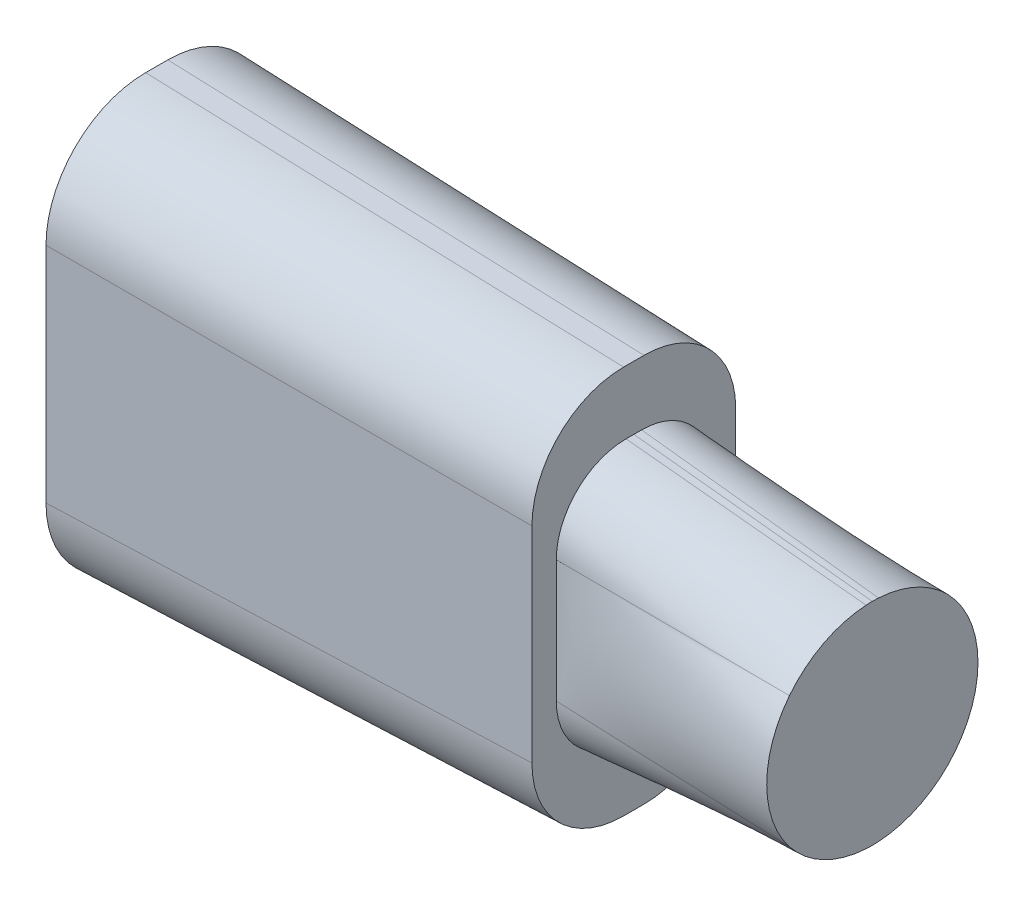
ISO-10303-21;
HEADER;
FILE_DESCRIPTION(('STEP AP214'),'2;1');
FILE_NAME('part.step','',(''),(''),'','','');
FILE_SCHEMA(('AUTOMOTIVE_DESIGN { 1 0 10303 214 1 1 1 1 }'));
ENDSEC;
DATA;
#1=APPLICATION_CONTEXT('core data for automotive mechanical design processes');
#2=APPLICATION_PROTOCOL_DEFINITION('international standard','automotive_design',2000,#1);
#3=PRODUCT_CONTEXT('',#1,'mechanical');
#4=PRODUCT('Part','Part','',(#3));
#5=PRODUCT_RELATED_PRODUCT_CATEGORY('part','',(#4));
#6=PRODUCT_DEFINITION_FORMATION('','',#4);
#7=PRODUCT_DEFINITION_CONTEXT('part definition',#1,'design');
#8=PRODUCT_DEFINITION('design','',#6,#7);
#9=PRODUCT_DEFINITION_SHAPE('','',#8);
#10=(LENGTH_UNIT() NAMED_UNIT(*) SI_UNIT(.MILLI.,.METRE.));
#11=(NAMED_UNIT(*) PLANE_ANGLE_UNIT() SI_UNIT($,.RADIAN.));
#12=(NAMED_UNIT(*) SI_UNIT($,.STERADIAN.) SOLID_ANGLE_UNIT());
#13=UNCERTAINTY_MEASURE_WITH_UNIT(LENGTH_MEASURE(1.E-05),#10,'distance_accuracy_value','');
#14=(GEOMETRIC_REPRESENTATION_CONTEXT(3) GLOBAL_UNCERTAINTY_ASSIGNED_CONTEXT((#13)) GLOBAL_UNIT_ASSIGNED_CONTEXT((#10,
#11,#12)) REPRESENTATION_CONTEXT('',''));
#15=CARTESIAN_POINT('',(0.,0.,0.));
#16=DIRECTION('',(0.,0.,1.));
#17=DIRECTION('',(1.,0.,0.));
#18=AXIS2_PLACEMENT_3D('',#15,#16,#17);
#19=CARTESIAN_POINT('',(7.,12.,204.5));
#20=DIRECTION('',(1.,0.,0.));
#21=DIRECTION('',(0.,1.,0.));
#22=AXIS2_PLACEMENT_3D('',#19,#20,#21);
#23=PLANE('',#22);
#24=CARTESIAN_POINT('',(7.,12.,204.5));
#25=DIRECTION('',(1.,0.,0.));
#26=DIRECTION('',(0.,1.,0.));
#27=AXIS2_PLACEMENT_3D('',#24,#25,#26);
#28=CIRCLE('',#27,3.1);
#29=CARTESIAN_POINT('',(7.,8.905414878114,204.68314727243));
#30=VERTEX_POINT('',#29);
#31=CARTESIAN_POINT('',(7.,8.905414878114,204.31685272756));
#32=VERTEX_POINT('',#31);
#33=EDGE_CURVE('E222',#30,#32,#28,.T.);
#34=ORIENTED_EDGE('',*,*,#33,.T.);
#35=CARTESIAN_POINT('',(7.,12.,204.5));
#36=DIRECTION('',(1.,0.,0.));
#37=DIRECTION('',(0.,1.,0.));
#38=AXIS2_PLACEMENT_3D('',#35,#36,#37);
#39=CIRCLE('',#38,3.1);
#40=CARTESIAN_POINT('',(7.,10.07880799349,202.06709612312));
#41=VERTEX_POINT('',#40);
#42=EDGE_CURVE('E10',#32,#41,#39,.T.);
#43=ORIENTED_EDGE('',*,*,#42,.T.);
#44=CARTESIAN_POINT('',(7.,12.,204.5));
#45=DIRECTION('',(1.,0.,0.));
#46=DIRECTION('',(0.,1.,0.));
#47=AXIS2_PLACEMENT_3D('',#44,#45,#46);
#48=CIRCLE('',#47,3.1);
#49=CARTESIAN_POINT('',(7.,13.92119200651,202.06709612312));
#50=VERTEX_POINT('',#49);
#51=EDGE_CURVE('E157',#41,#50,#48,.T.);
#52=ORIENTED_EDGE('',*,*,#51,.T.);
#53=CARTESIAN_POINT('',(7.,12.,204.5));
#54=DIRECTION('',(1.,0.,0.));
#55=DIRECTION('',(0.,1.,0.));
#56=AXIS2_PLACEMENT_3D('',#53,#54,#55);
#57=CIRCLE('',#56,3.1);
#58=CARTESIAN_POINT('',(7.,15.094585121886,204.31685272756));
#59=VERTEX_POINT('',#58);
#60=EDGE_CURVE('E151',#50,#59,#57,.T.);
#61=ORIENTED_EDGE('',*,*,#60,.T.);
#62=CARTESIAN_POINT('',(7.,12.,204.5));
#63=DIRECTION('',(1.,0.,0.));
#64=DIRECTION('',(0.,1.,0.));
#65=AXIS2_PLACEMENT_3D('',#62,#63,#64);
#66=CIRCLE('',#65,3.1);
#67=CARTESIAN_POINT('',(7.,15.1,204.5));
#68=VERTEX_POINT('',#67);
#69=EDGE_CURVE('E154',#59,#68,#66,.T.);
#70=ORIENTED_EDGE('',*,*,#69,.T.);
#71=CARTESIAN_POINT('',(7.,12.,204.5));
#72=DIRECTION('',(1.,0.,0.));
#73=DIRECTION('',(0.,1.,0.));
#74=AXIS2_PLACEMENT_3D('',#71,#72,#73);
#75=CIRCLE('',#74,3.1);
#76=CARTESIAN_POINT('',(7.,15.094585121886,204.68314727243));
#77=VERTEX_POINT('',#76);
#78=EDGE_CURVE('E181',#68,#77,#75,.T.);
#79=ORIENTED_EDGE('',*,*,#78,.T.);
#80=CARTESIAN_POINT('',(7.,12.,204.5));
#81=DIRECTION('',(1.,0.,0.));
#82=DIRECTION('',(0.,1.,0.));
#83=AXIS2_PLACEMENT_3D('',#80,#81,#82);
#84=CIRCLE('',#83,3.1);
#85=CARTESIAN_POINT('',(7.,13.92119200651,206.93290387687));
#86=VERTEX_POINT('',#85);
#87=EDGE_CURVE('E312',#77,#86,#84,.T.);
#88=ORIENTED_EDGE('',*,*,#87,.T.);
#89=CARTESIAN_POINT('',(7.,12.,204.5));
#90=DIRECTION('',(1.,0.,0.));
#91=DIRECTION('',(0.,1.,0.));
#92=AXIS2_PLACEMENT_3D('',#89,#90,#91);
#93=CIRCLE('',#92,3.1);
#94=CARTESIAN_POINT('',(7.,10.07880799349,206.93290387687));
#95=VERTEX_POINT('',#94);
#96=EDGE_CURVE('E334',#86,#95,#93,.T.);
#97=ORIENTED_EDGE('',*,*,#96,.T.);
#98=CARTESIAN_POINT('',(7.,12.,204.5));
#99=DIRECTION('',(1.,0.,0.));
#100=DIRECTION('',(0.,1.,0.));
#101=AXIS2_PLACEMENT_3D('',#98,#99,#100);
#102=CIRCLE('',#101,3.1);
#103=EDGE_CURVE('E221',#95,#30,#102,.T.);
#104=ORIENTED_EDGE('',*,*,#103,.T.);
#105=EDGE_LOOP('',(#34,#43,#52,#61,#70,#79,#88,#97,#104));
#106=FACE_BOUND('',#105,.T.);
#107=ADVANCED_FACE('F15',(#106),#23,.T.);
#108=CARTESIAN_POINT('',(0.,8.156,204.2725));
#109=CARTESIAN_POINT('',(7.,8.905414878114,204.31685272756));
#110=CARTESIAN_POINT('',(-2.007283228522E-13,8.156,203.87047431511));
#111=CARTESIAN_POINT('',(7.,8.924720239559,203.99065576319));
#112=CARTESIAN_POINT('',(5.790923296445E-13,8.246214465398,203.46844850367));
#113=CARTESIAN_POINT('',(7.,8.983321421316,203.66678504075));
#114=CARTESIAN_POINT('',(-8.739675649849E-13,8.426642510128,203.09004165269));
#115=CARTESIAN_POINT('',(7.,9.080892764888,203.350760774));
#116=CARTESIAN_POINT('',(8.171241461241E-13,8.68986769754,202.75886769754));
#117=CARTESIAN_POINT('',(7.,9.216174075245,203.0480553016));
#118=CARTESIAN_POINT('',(-5.204725539443E-13,9.021041652699,202.49564251012));
#119=CARTESIAN_POINT('',(7.,9.386987752643,202.76388224944));
#120=CARTESIAN_POINT('',(2.344791028008E-13,9.399448503675,202.31521446539));
#121=CARTESIAN_POINT('',(7.,9.590304578245,202.50301106919));
#122=CARTESIAN_POINT('',(0.,9.801474315111,202.225));
#123=CARTESIAN_POINT('',(7.,9.822358153527,202.26960695279));
#124=CARTESIAN_POINT('',(0.,10.2035,202.225));
#125=CARTESIAN_POINT('',(7.,10.07880799349,202.06709612312));
#126=(BOUNDED_SURFACE() B_SPLINE_SURFACE(8,1,((#108,#109),(#110,#111),(#112,#113),(#114,#115),
(#116,#117),(#118,#119),(#120,#121),(#122,#123),(#124,#125)),.UNSPECIFIED.,.F.,.F.,
.F.) B_SPLINE_SURFACE_WITH_KNOTS((9,9),(2,2),(3.14159265359,4.712388980385),(0.,1.),
.UNSPECIFIED.) GEOMETRIC_REPRESENTATION_ITEM() RATIONAL_B_SPLINE_SURFACE(((1.,1.),(1.,1.),(1.,
1.),(1.,1.),(1.,1.),(1.,1.),(1.,1.),(1.,1.),(1.,1.))) REPRESENTATION_ITEM('') SURFACE());
#127=CARTESIAN_POINT('',(0.,10.2035,204.2725));
#128=DIRECTION('',(1.,0.,0.));
#129=DIRECTION('',(0.,1.,0.));
#130=AXIS2_PLACEMENT_3D('',#127,#128,#129);
#131=CIRCLE('',#130,2.0475);
#132=CARTESIAN_POINT('',(0.,8.156,204.2725));
#133=VERTEX_POINT('',#132);
#134=CARTESIAN_POINT('',(0.,10.2035,202.225));
#135=VERTEX_POINT('',#134);
#136=EDGE_CURVE('E327',#133,#135,#131,.T.);
#137=CARTESIAN_POINT('',(0.,10.2035,202.225));
#138=CARTESIAN_POINT('',(7.,10.07880799349,202.06709612312));
#139=(BOUNDED_CURVE() B_SPLINE_CURVE(1,(#137,#138),.UNSPECIFIED.,.F.,
.F.) B_SPLINE_CURVE_WITH_KNOTS((2,2),(0.,1.),
.UNSPECIFIED.) CURVE() GEOMETRIC_REPRESENTATION_ITEM() RATIONAL_B_SPLINE_CURVE((1.,1.)) REPRESENTATION_ITEM(''));
#140=EDGE_CURVE('E28',#135,#41,#139,.T.);
#141=CARTESIAN_POINT('',(0.,8.156,204.2725));
#142=CARTESIAN_POINT('',(7.,8.905414878114,204.31685272756));
#143=(BOUNDED_CURVE() B_SPLINE_CURVE(1,(#141,#142),.UNSPECIFIED.,.F.,
.F.) B_SPLINE_CURVE_WITH_KNOTS((2,2),(0.,1.),
.UNSPECIFIED.) CURVE() GEOMETRIC_REPRESENTATION_ITEM() RATIONAL_B_SPLINE_CURVE((1.,1.)) REPRESENTATION_ITEM(''));
#144=EDGE_CURVE('E247',#133,#32,#143,.T.);
#145=ORIENTED_EDGE('',*,*,#136,.T.);
#146=ORIENTED_EDGE('',*,*,#140,.T.);
#147=ORIENTED_EDGE('',*,*,#42,.F.);
#148=ORIENTED_EDGE('',*,*,#144,.F.);
#149=EDGE_LOOP('',(#145,#146,#147,#148));
#150=FACE_BOUND('',#149,.T.);
#151=ADVANCED_FACE('F503',(#150),#126,.T.);
#152=CARTESIAN_POINT('',(0.,10.2035,202.225));
#153=CARTESIAN_POINT('',(7.,10.07880799349,202.06709612312));
#154=CARTESIAN_POINT('',(0.,10.716785714286,202.225));
#155=CARTESIAN_POINT('',(7.,10.543430455139,201.70019755066));
#156=CARTESIAN_POINT('',(0.,11.230071428571,202.225));
#157=CARTESIAN_POINT('',(7.,11.089799289267,201.43681990893));
#158=CARTESIAN_POINT('',(0.,11.743357142857,202.225));
#159=CARTESIAN_POINT('',(7.,11.69023630962,201.29880874034));
#160=CARTESIAN_POINT('',(0.,12.256642857143,202.225));
#161=CARTESIAN_POINT('',(7.,12.30976369038,201.29880874034));
#162=CARTESIAN_POINT('',(0.,12.769928571429,202.225));
#163=CARTESIAN_POINT('',(7.,12.910200710733,201.43681990893));
#164=CARTESIAN_POINT('',(0.,13.283214285714,202.225));
#165=CARTESIAN_POINT('',(7.,13.456569544861,201.70019755066));
#166=CARTESIAN_POINT('',(0.,13.7965,202.225));
#167=CARTESIAN_POINT('',(7.,13.92119200651,202.06709612312));
#168=(BOUNDED_SURFACE() B_SPLINE_SURFACE(7,1,((#152,#153),(#154,#155),(#156,#157),(#158,#159),
(#160,#161),(#162,#163),(#164,#165),(#166,#167)),.UNSPECIFIED.,.F.,.F.,
.F.) B_SPLINE_SURFACE_WITH_KNOTS((8,8),(2,2),(-1.7965,1.7965),(0.,1.),
.UNSPECIFIED.) GEOMETRIC_REPRESENTATION_ITEM() RATIONAL_B_SPLINE_SURFACE(((1.,1.),(1.,1.),(1.,
1.),(1.,1.),(1.,1.),(1.,1.),(1.,1.),(1.,1.))) REPRESENTATION_ITEM('') SURFACE());
#169=DIRECTION('',(0.,1.,0.));
#170=VECTOR('',#169,1.);
#171=CARTESIAN_POINT('',(0.,12.,202.225));
#172=LINE('',#171,#170);
#173=CARTESIAN_POINT('',(0.,13.7965,202.225));
#174=VERTEX_POINT('',#173);
#175=EDGE_CURVE('E267',#135,#174,#172,.T.);
#176=CARTESIAN_POINT('',(0.,13.7965,202.225));
#177=CARTESIAN_POINT('',(7.,13.92119200651,202.06709612312));
#178=(BOUNDED_CURVE() B_SPLINE_CURVE(1,(#176,#177),.UNSPECIFIED.,.F.,
.F.) B_SPLINE_CURVE_WITH_KNOTS((2,2),(0.,1.),
.UNSPECIFIED.) CURVE() GEOMETRIC_REPRESENTATION_ITEM() RATIONAL_B_SPLINE_CURVE((1.,1.)) REPRESENTATION_ITEM(''));
#179=EDGE_CURVE('E161',#174,#50,#178,.T.);
#180=ORIENTED_EDGE('',*,*,#175,.T.);
#181=ORIENTED_EDGE('',*,*,#179,.T.);
#182=ORIENTED_EDGE('',*,*,#51,.F.);
#183=ORIENTED_EDGE('',*,*,#140,.F.);
#184=EDGE_LOOP('',(#180,#181,#182,#183));
#185=FACE_BOUND('',#184,.T.);
#186=ADVANCED_FACE('F532',(#185),#168,.T.);
#187=CARTESIAN_POINT('',(0.,13.7965,202.225));
#188=CARTESIAN_POINT('',(7.,13.92119200651,202.06709612312));
#189=CARTESIAN_POINT('',(-1.261213355974E-13,14.198525684889,202.225));
#190=CARTESIAN_POINT('',(7.,14.177641846473,202.26960695279));
#191=CARTESIAN_POINT('',(4.583000645653E-13,14.600551496325,202.31521446539));
#192=CARTESIAN_POINT('',(7.,14.409695421755,202.50301106919));
#193=CARTESIAN_POINT('',(-7.673861546209E-13,14.978958347301,202.49564251012));
#194=CARTESIAN_POINT('',(7.,14.613012247357,202.76388224944));
#195=CARTESIAN_POINT('',(8.100187187665E-13,15.31013230246,202.75886769754));
#196=CARTESIAN_POINT('',(7.,14.783825924755,203.0480553016));
#197=CARTESIAN_POINT('',(-5.968558980385E-13,15.573357489872,203.09004165269));
#198=CARTESIAN_POINT('',(7.,14.919107235112,203.350760774));
#199=CARTESIAN_POINT('',(2.93098878501E-13,15.753785534602,203.46844850367));
#200=CARTESIAN_POINT('',(7.,15.016678578684,203.66678504075));
#201=CARTESIAN_POINT('',(0.,15.844,203.87047431511));
#202=CARTESIAN_POINT('',(7.,15.075279760441,203.99065576319));
#203=CARTESIAN_POINT('',(0.,15.844,204.2725));
#204=CARTESIAN_POINT('',(7.,15.094585121886,204.31685272756));
#205=(BOUNDED_SURFACE() B_SPLINE_SURFACE(8,1,((#187,#188),(#189,#190),(#191,#192),(#193,#194),
(#195,#196),(#197,#198),(#199,#200),(#201,#202),(#203,#204)),.UNSPECIFIED.,.F.,.F.,
.F.) B_SPLINE_SURFACE_WITH_KNOTS((9,9),(2,2),(4.712388980385,6.28318530718),(0.,1.),
.UNSPECIFIED.) GEOMETRIC_REPRESENTATION_ITEM() RATIONAL_B_SPLINE_SURFACE(((1.,1.),(1.,1.),(1.,
1.),(1.,1.),(1.,1.),(1.,1.),(1.,1.),(1.,1.),(1.,1.))) REPRESENTATION_ITEM('') SURFACE());
#206=CARTESIAN_POINT('',(0.,13.7965,204.2725));
#207=DIRECTION('',(1.,0.,0.));
#208=DIRECTION('',(0.,1.,0.));
#209=AXIS2_PLACEMENT_3D('',#206,#207,#208);
#210=CIRCLE('',#209,2.0475);
#211=CARTESIAN_POINT('',(0.,15.844,204.2725));
#212=VERTEX_POINT('',#211);
#213=EDGE_CURVE('E167',#174,#212,#210,.T.);
#214=CARTESIAN_POINT('',(0.,15.844,204.2725));
#215=CARTESIAN_POINT('',(7.,15.094585121886,204.31685272756));
#216=(BOUNDED_CURVE() B_SPLINE_CURVE(1,(#214,#215),.UNSPECIFIED.,.F.,
.F.) B_SPLINE_CURVE_WITH_KNOTS((2,2),(0.,1.),
.UNSPECIFIED.) CURVE() GEOMETRIC_REPRESENTATION_ITEM() RATIONAL_B_SPLINE_CURVE((1.,1.)) REPRESENTATION_ITEM(''));
#217=EDGE_CURVE('E162',#212,#59,#216,.T.);
#218=ORIENTED_EDGE('',*,*,#213,.T.);
#219=ORIENTED_EDGE('',*,*,#217,.T.);
#220=ORIENTED_EDGE('',*,*,#60,.F.);
#221=ORIENTED_EDGE('',*,*,#179,.F.);
#222=EDGE_LOOP('',(#218,#219,#220,#221));
#223=FACE_BOUND('',#222,.T.);
#224=ADVANCED_FACE('F165',(#223),#205,.T.);
#225=CARTESIAN_POINT('',(0.,15.844,204.2725));
#226=CARTESIAN_POINT('',(7.,15.094585121886,204.31685272756));
#227=CARTESIAN_POINT('',(0.,15.844,204.34833333333));
#228=CARTESIAN_POINT('',(7.,15.098193989333,204.37783069005));
#229=CARTESIAN_POINT('',(0.,15.844,204.42416666666));
#230=CARTESIAN_POINT('',(7.,15.1,204.43891533881));
#231=CARTESIAN_POINT('',(0.,15.844,204.5));
#232=CARTESIAN_POINT('',(7.,15.1,204.5));
#233=(BOUNDED_SURFACE() B_SPLINE_SURFACE(3,1,((#225,#226),(#227,#228),(#229,#230),(#231,#232)),
.UNSPECIFIED.,.F.,.F.,.F.) B_SPLINE_SURFACE_WITH_KNOTS((4,4),(2,2),(-0.2275,0.),(0.,1.),
.UNSPECIFIED.) GEOMETRIC_REPRESENTATION_ITEM() RATIONAL_B_SPLINE_SURFACE(((1.,1.),(1.,1.),(1.,
1.),(1.,1.))) REPRESENTATION_ITEM('') SURFACE());
#234=DIRECTION('',(0.,0.,1.));
#235=VECTOR('',#234,1.);
#236=CARTESIAN_POINT('',(0.,15.844,204.5));
#237=LINE('',#236,#235);
#238=CARTESIAN_POINT('',(0.,15.844,204.5));
#239=VERTEX_POINT('',#238);
#240=EDGE_CURVE('E188',#212,#239,#237,.T.);
#241=CARTESIAN_POINT('',(0.,15.844,204.5));
#242=CARTESIAN_POINT('',(7.,15.1,204.5));
#243=(BOUNDED_CURVE() B_SPLINE_CURVE(1,(#241,#242),.UNSPECIFIED.,.F.,
.F.) B_SPLINE_CURVE_WITH_KNOTS((2,2),(0.,1.),
.UNSPECIFIED.) CURVE() GEOMETRIC_REPRESENTATION_ITEM() RATIONAL_B_SPLINE_CURVE((1.,1.)) REPRESENTATION_ITEM(''));
#244=EDGE_CURVE('E174',#239,#68,#243,.T.);
#245=ORIENTED_EDGE('',*,*,#240,.T.);
#246=ORIENTED_EDGE('',*,*,#244,.T.);
#247=ORIENTED_EDGE('',*,*,#69,.F.);
#248=ORIENTED_EDGE('',*,*,#217,.F.);
#249=EDGE_LOOP('',(#245,#246,#247,#248));
#250=FACE_BOUND('',#249,.T.);
#251=ADVANCED_FACE('F173',(#250),#233,.T.);
#252=CARTESIAN_POINT('',(0.,15.844,204.5));
#253=CARTESIAN_POINT('',(7.,15.1,204.5));
#254=CARTESIAN_POINT('',(0.,15.844,204.57583333333));
#255=CARTESIAN_POINT('',(7.,15.1,204.56108466119));
#256=CARTESIAN_POINT('',(0.,15.844,204.65166666666));
#257=CARTESIAN_POINT('',(7.,15.098193989333,204.62216930995));
#258=CARTESIAN_POINT('',(0.,15.844,204.7275));
#259=CARTESIAN_POINT('',(7.,15.094585121886,204.68314727243));
#260=(BOUNDED_SURFACE() B_SPLINE_SURFACE(3,1,((#252,#253),(#254,#255),(#256,#257),(#258,#259)),
.UNSPECIFIED.,.F.,.F.,.F.) B_SPLINE_SURFACE_WITH_KNOTS((4,4),(2,2),(0.,0.2275),(0.,1.),
.UNSPECIFIED.) GEOMETRIC_REPRESENTATION_ITEM() RATIONAL_B_SPLINE_SURFACE(((1.,1.),(1.,1.),(1.,
1.),(1.,1.))) REPRESENTATION_ITEM('') SURFACE());
#261=DIRECTION('',(0.,0.,1.));
#262=VECTOR('',#261,1.);
#263=CARTESIAN_POINT('',(0.,15.844,204.5));
#264=LINE('',#263,#262);
#265=CARTESIAN_POINT('',(0.,15.844,204.7275));
#266=VERTEX_POINT('',#265);
#267=EDGE_CURVE('E185',#239,#266,#264,.T.);
#268=CARTESIAN_POINT('',(0.,15.844,204.7275));
#269=CARTESIAN_POINT('',(7.,15.094585121886,204.68314727243));
#270=(BOUNDED_CURVE() B_SPLINE_CURVE(1,(#268,#269),.UNSPECIFIED.,.F.,
.F.) B_SPLINE_CURVE_WITH_KNOTS((2,2),(0.,1.),
.UNSPECIFIED.) CURVE() GEOMETRIC_REPRESENTATION_ITEM() RATIONAL_B_SPLINE_CURVE((1.,1.)) REPRESENTATION_ITEM(''));
#271=EDGE_CURVE('E202',#266,#77,#270,.T.);
#272=ORIENTED_EDGE('',*,*,#267,.T.);
#273=ORIENTED_EDGE('',*,*,#271,.T.);
#274=ORIENTED_EDGE('',*,*,#78,.F.);
#275=ORIENTED_EDGE('',*,*,#244,.F.);
#276=EDGE_LOOP('',(#272,#273,#274,#275));
#277=FACE_BOUND('',#276,.T.);
#278=ADVANCED_FACE('F540',(#277),#260,.T.);
#279=CARTESIAN_POINT('',(0.,15.844,204.7275));
#280=CARTESIAN_POINT('',(7.,15.094585121886,204.68314727243));
#281=CARTESIAN_POINT('',(0.,15.844,205.12952568488));
#282=CARTESIAN_POINT('',(7.,15.075279760441,205.00934423681));
#283=CARTESIAN_POINT('',(0.,15.753785534602,205.53155149632));
#284=CARTESIAN_POINT('',(7.,15.016678578684,205.33321495924));
#285=CARTESIAN_POINT('',(0.,15.573357489872,205.9099583473));
#286=CARTESIAN_POINT('',(7.,14.919107235112,205.64923922599));
#287=CARTESIAN_POINT('',(0.,15.310132302459,206.24113230245));
#288=CARTESIAN_POINT('',(7.,14.783825924755,205.9519446984));
#289=CARTESIAN_POINT('',(0.,14.978958347301,206.50435748987));
#290=CARTESIAN_POINT('',(7.,14.613012247357,206.23611775055));
#291=CARTESIAN_POINT('',(0.,14.600551496325,206.6847855346));
#292=CARTESIAN_POINT('',(7.,14.409695421755,206.4969889308));
#293=CARTESIAN_POINT('',(0.,14.198525684889,206.775));
#294=CARTESIAN_POINT('',(7.,14.177641846473,206.7303930472));
#295=CARTESIAN_POINT('',(0.,13.7965,206.775));
#296=CARTESIAN_POINT('',(7.,13.92119200651,206.93290387687));
#297=(BOUNDED_SURFACE() B_SPLINE_SURFACE(8,1,((#279,#280),(#281,#282),(#283,#284),(#285,#286),
(#287,#288),(#289,#290),(#291,#292),(#293,#294),(#295,#296)),.UNSPECIFIED.,.F.,.F.,
.F.) B_SPLINE_SURFACE_WITH_KNOTS((9,9),(2,2),(0.,1.570796326795),(0.,1.),
.UNSPECIFIED.) GEOMETRIC_REPRESENTATION_ITEM() RATIONAL_B_SPLINE_SURFACE(((1.,1.),(1.,1.),(1.,
1.),(1.,1.),(1.,1.),(1.,1.),(1.,1.),(1.,1.),(1.,1.))) REPRESENTATION_ITEM('') SURFACE());
#298=CARTESIAN_POINT('',(0.,13.7965,204.7275));
#299=DIRECTION('',(1.,0.,0.));
#300=DIRECTION('',(0.,1.,0.));
#301=AXIS2_PLACEMENT_3D('',#298,#299,#300);
#302=CIRCLE('',#301,2.0475);
#303=CARTESIAN_POINT('',(0.,13.7965,206.775));
#304=VERTEX_POINT('',#303);
#305=EDGE_CURVE('E189',#266,#304,#302,.T.);
#306=CARTESIAN_POINT('',(0.,13.7965,206.775));
#307=CARTESIAN_POINT('',(7.,13.92119200651,206.93290387687));
#308=(BOUNDED_CURVE() B_SPLINE_CURVE(1,(#306,#307),.UNSPECIFIED.,.F.,
.F.) B_SPLINE_CURVE_WITH_KNOTS((2,2),(0.,1.),
.UNSPECIFIED.) CURVE() GEOMETRIC_REPRESENTATION_ITEM() RATIONAL_B_SPLINE_CURVE((1.,1.)) REPRESENTATION_ITEM(''));
#309=EDGE_CURVE('E337',#304,#86,#308,.T.);
#310=ORIENTED_EDGE('',*,*,#305,.T.);
#311=ORIENTED_EDGE('',*,*,#309,.T.);
#312=ORIENTED_EDGE('',*,*,#87,.F.);
#313=ORIENTED_EDGE('',*,*,#271,.F.);
#314=EDGE_LOOP('',(#310,#311,#312,#313));
#315=FACE_BOUND('',#314,.T.);
#316=ADVANCED_FACE('F545',(#315),#297,.T.);
#317=CARTESIAN_POINT('',(0.,13.7965,206.775));
#318=CARTESIAN_POINT('',(7.,13.92119200651,206.93290387687));
#319=CARTESIAN_POINT('',(0.,13.283214285714,206.775));
#320=CARTESIAN_POINT('',(7.,13.456569544861,207.29980244933));
#321=CARTESIAN_POINT('',(0.,12.769928571429,206.775));
#322=CARTESIAN_POINT('',(7.,12.910200710733,207.56318009106));
#323=CARTESIAN_POINT('',(0.,12.256642857143,206.775));
#324=CARTESIAN_POINT('',(7.,12.30976369038,207.70119125965));
#325=CARTESIAN_POINT('',(0.,11.743357142857,206.775));
#326=CARTESIAN_POINT('',(7.,11.69023630962,207.70119125965));
#327=CARTESIAN_POINT('',(0.,11.230071428571,206.775));
#328=CARTESIAN_POINT('',(7.,11.089799289267,207.56318009106));
#329=CARTESIAN_POINT('',(0.,10.716785714286,206.775));
#330=CARTESIAN_POINT('',(7.,10.543430455139,207.29980244933));
#331=CARTESIAN_POINT('',(0.,10.2035,206.775));
#332=CARTESIAN_POINT('',(7.,10.07880799349,206.93290387687));
#333=(BOUNDED_SURFACE() B_SPLINE_SURFACE(7,1,((#317,#318),(#319,#320),(#321,#322),(#323,#324),
(#325,#326),(#327,#328),(#329,#330),(#331,#332)),.UNSPECIFIED.,.F.,.F.,
.F.) B_SPLINE_SURFACE_WITH_KNOTS((8,8),(2,2),(-1.7965,1.7965),(0.,1.),
.UNSPECIFIED.) GEOMETRIC_REPRESENTATION_ITEM() RATIONAL_B_SPLINE_SURFACE(((1.,1.),(1.,1.),(1.,
1.),(1.,1.),(1.,1.),(1.,1.),(1.,1.),(1.,1.))) REPRESENTATION_ITEM('') SURFACE());
#334=DIRECTION('',(0.,1.,0.));
#335=VECTOR('',#334,1.);
#336=CARTESIAN_POINT('',(0.,12.,206.775));
#337=LINE('',#336,#335);
#338=CARTESIAN_POINT('',(0.,10.2035,206.775));
#339=VERTEX_POINT('',#338);
#340=EDGE_CURVE('E246',#339,#304,#337,.T.);
#341=CARTESIAN_POINT('',(0.,10.2035,206.775));
#342=CARTESIAN_POINT('',(7.,10.07880799349,206.93290387687));
#343=(BOUNDED_CURVE() B_SPLINE_CURVE(1,(#341,#342),.UNSPECIFIED.,.F.,
.F.) B_SPLINE_CURVE_WITH_KNOTS((2,2),(0.,1.),
.UNSPECIFIED.) CURVE() GEOMETRIC_REPRESENTATION_ITEM() RATIONAL_B_SPLINE_CURVE((1.,1.)) REPRESENTATION_ITEM(''));
#344=EDGE_CURVE('E270',#339,#95,#343,.T.);
#345=ORIENTED_EDGE('',*,*,#340,.F.);
#346=ORIENTED_EDGE('',*,*,#344,.T.);
#347=ORIENTED_EDGE('',*,*,#96,.F.);
#348=ORIENTED_EDGE('',*,*,#309,.F.);
#349=EDGE_LOOP('',(#345,#346,#347,#348));
#350=FACE_BOUND('',#349,.T.);
#351=ADVANCED_FACE('F554',(#350),#333,.T.);
#352=CARTESIAN_POINT('',(0.,10.2035,206.775));
#353=CARTESIAN_POINT('',(7.,10.07880799349,206.93290387687));
#354=CARTESIAN_POINT('',(0.,9.801474315111,206.775));
#355=CARTESIAN_POINT('',(7.,9.822358153527,206.7303930472));
#356=CARTESIAN_POINT('',(3.002043058586E-13,9.399448503675,206.6847855346));
#357=CARTESIAN_POINT('',(7.,9.590304578245,206.4969889308));
#358=CARTESIAN_POINT('',(-5.009326287109E-13,9.021041652699,206.50435748987));
#359=CARTESIAN_POINT('',(7.,9.386987752643,206.23611775055));
#360=CARTESIAN_POINT('',(4.813927034775E-13,8.689867697541,206.24113230245));
#361=CARTESIAN_POINT('',(7.,9.216174075245,205.9519446984));
#362=CARTESIAN_POINT('',(-2.966515921798E-13,8.426642510128,205.9099583473));
#363=CARTESIAN_POINT('',(7.,9.080892764888,205.64923922599));
#364=CARTESIAN_POINT('',(1.083577672034E-13,8.246214465398,205.53155149632));
#365=CARTESIAN_POINT('',(7.,8.983321421316,205.33321495924));
#366=CARTESIAN_POINT('',(0.,8.156,205.12952568488));
#367=CARTESIAN_POINT('',(7.,8.924720239559,205.00934423681));
#368=CARTESIAN_POINT('',(0.,8.156,204.7275));
#369=CARTESIAN_POINT('',(7.,8.905414878114,204.68314727243));
#370=(BOUNDED_SURFACE() B_SPLINE_SURFACE(8,1,((#352,#353),(#354,#355),(#356,#357),(#358,#359),
(#360,#361),(#362,#363),(#364,#365),(#366,#367),(#368,#369)),.UNSPECIFIED.,.F.,.F.,
.F.) B_SPLINE_SURFACE_WITH_KNOTS((9,9),(2,2),(1.570796326795,3.14159265359),(0.,1.),
.UNSPECIFIED.) GEOMETRIC_REPRESENTATION_ITEM() RATIONAL_B_SPLINE_SURFACE(((1.,1.),(1.,1.),(1.,
1.),(1.,1.),(1.,1.),(1.,1.),(1.,1.),(1.,1.),(1.,1.))) REPRESENTATION_ITEM('') SURFACE());
#371=CARTESIAN_POINT('',(0.,10.2035,204.7275));
#372=DIRECTION('',(1.,0.,0.));
#373=DIRECTION('',(0.,1.,0.));
#374=AXIS2_PLACEMENT_3D('',#371,#372,#373);
#375=CIRCLE('',#374,2.0475);
#376=CARTESIAN_POINT('',(0.,8.156,204.7275));
#377=VERTEX_POINT('',#376);
#378=EDGE_CURVE('E294',#339,#377,#375,.T.);
#379=CARTESIAN_POINT('',(0.,8.156,204.7275));
#380=CARTESIAN_POINT('',(7.,8.905414878114,204.68314727243));
#381=(BOUNDED_CURVE() B_SPLINE_CURVE(1,(#379,#380),.UNSPECIFIED.,.F.,
.F.) B_SPLINE_CURVE_WITH_KNOTS((2,2),(0.,1.),
.UNSPECIFIED.) CURVE() GEOMETRIC_REPRESENTATION_ITEM() RATIONAL_B_SPLINE_CURVE((1.,1.)) REPRESENTATION_ITEM(''));
#382=EDGE_CURVE('E215',#377,#30,#381,.T.);
#383=ORIENTED_EDGE('',*,*,#378,.T.);
#384=ORIENTED_EDGE('',*,*,#382,.T.);
#385=ORIENTED_EDGE('',*,*,#103,.F.);
#386=ORIENTED_EDGE('',*,*,#344,.F.);
#387=EDGE_LOOP('',(#383,#384,#385,#386));
#388=FACE_BOUND('',#387,.T.);
#389=ADVANCED_FACE('F559',(#388),#370,.T.);
#390=CARTESIAN_POINT('',(0.,8.156,204.7275));
#391=CARTESIAN_POINT('',(7.,8.905414878114,204.68314727243));
#392=CARTESIAN_POINT('',(0.,8.156,204.61375));
#393=CARTESIAN_POINT('',(7.,8.900001576944,204.5916803287));
#394=CARTESIAN_POINT('',(0.,8.156,204.5));
#395=CARTESIAN_POINT('',(7.,8.898192938082,204.5));
#396=CARTESIAN_POINT('',(0.,8.156,204.38625));
#397=CARTESIAN_POINT('',(7.,8.900001576944,204.40831967129));
#398=CARTESIAN_POINT('',(0.,8.156,204.2725));
#399=CARTESIAN_POINT('',(7.,8.905414878114,204.31685272756));
#400=(BOUNDED_SURFACE() B_SPLINE_SURFACE(4,1,((#390,#391),(#392,#393),(#394,#395),(#396,#397),
(#398,#399)),.UNSPECIFIED.,.F.,.F.,.F.) B_SPLINE_SURFACE_WITH_KNOTS((5,5),(2,2),(-0.2275,
0.2275),(0.,1.),.UNSPECIFIED.) GEOMETRIC_REPRESENTATION_ITEM() RATIONAL_B_SPLINE_SURFACE(((1.,
1.),(1.,1.),(1.,1.),(1.,1.),(1.,1.))) REPRESENTATION_ITEM('') SURFACE());
#401=DIRECTION('',(0.,0.,1.));
#402=VECTOR('',#401,1.);
#403=CARTESIAN_POINT('',(0.,8.156,204.5));
#404=LINE('',#403,#402);
#405=EDGE_CURVE('E196',#133,#377,#404,.T.);
#406=ORIENTED_EDGE('',*,*,#405,.F.);
#407=ORIENTED_EDGE('',*,*,#144,.T.);
#408=ORIENTED_EDGE('',*,*,#33,.F.);
#409=ORIENTED_EDGE('',*,*,#382,.F.);
#410=EDGE_LOOP('',(#406,#407,#408,#409));
#411=FACE_BOUND('',#410,.T.);
#412=ADVANCED_FACE('F571',(#411),#400,.T.);
#413=CARTESIAN_POINT('',(-14.,15.275,207.75));
#414=CARTESIAN_POINT('',(0.,15.013,207.49));
#415=CARTESIAN_POINT('',(-14.,8.725,207.75));
#416=CARTESIAN_POINT('',(0.,8.987,207.49));
#417=(BOUNDED_SURFACE() B_SPLINE_SURFACE(1,1,((#413,#414),(#415,#416)),.UNSPECIFIED.,.F.,.F.,
.F.) B_SPLINE_SURFACE_WITH_KNOTS((2,2),(2,2),(-3.275,3.275),(0.,1.),
.UNSPECIFIED.) GEOMETRIC_REPRESENTATION_ITEM() RATIONAL_B_SPLINE_SURFACE(((1.,1.),(1.,1.))) REPRESENTATION_ITEM('') SURFACE());
#418=DIRECTION('',(0.,1.,0.));
#419=VECTOR('',#418,1.);
#420=CARTESIAN_POINT('',(-14.,12.,207.75));
#421=LINE('',#420,#419);
#422=CARTESIAN_POINT('',(-14.,8.725,207.75));
#423=VERTEX_POINT('',#422);
#424=CARTESIAN_POINT('',(-14.,15.275,207.75));
#425=VERTEX_POINT('',#424);
#426=EDGE_CURVE('E403',#423,#425,#421,.T.);
#427=CARTESIAN_POINT('',(-14.,8.725,207.75));
#428=CARTESIAN_POINT('',(0.,8.987,207.49));
#429=(BOUNDED_CURVE() B_SPLINE_CURVE(1,(#427,#428),.UNSPECIFIED.,.F.,
.F.) B_SPLINE_CURVE_WITH_KNOTS((2,2),(0.,1.),
.UNSPECIFIED.) CURVE() GEOMETRIC_REPRESENTATION_ITEM() RATIONAL_B_SPLINE_CURVE((1.,1.)) REPRESENTATION_ITEM(''));
#430=CARTESIAN_POINT('',(0.,8.987,207.49));
#431=VERTEX_POINT('',#430);
#432=EDGE_CURVE('E190',#423,#431,#429,.T.);
#433=DIRECTION('',(0.,1.,0.));
#434=VECTOR('',#433,1.);
#435=CARTESIAN_POINT('',(0.,12.,207.49));
#436=LINE('',#435,#434);
#437=CARTESIAN_POINT('',(0.,15.013,207.49));
#438=VERTEX_POINT('',#437);
#439=EDGE_CURVE('E229',#431,#438,#436,.T.);
#440=CARTESIAN_POINT('',(-14.,15.275,207.75));
#441=CARTESIAN_POINT('',(0.,15.013,207.49));
#442=(BOUNDED_CURVE() B_SPLINE_CURVE(1,(#440,#441),.UNSPECIFIED.,.F.,
.F.) B_SPLINE_CURVE_WITH_KNOTS((2,2),(0.,1.),
.UNSPECIFIED.) CURVE() GEOMETRIC_REPRESENTATION_ITEM() RATIONAL_B_SPLINE_CURVE((1.,1.)) REPRESENTATION_ITEM(''));
#443=EDGE_CURVE('E253',#425,#438,#442,.T.);
#444=ORIENTED_EDGE('',*,*,#426,.F.);
#445=ORIENTED_EDGE('',*,*,#432,.T.);
#446=ORIENTED_EDGE('',*,*,#439,.T.);
#447=ORIENTED_EDGE('',*,*,#443,.F.);
#448=EDGE_LOOP('',(#444,#445,#446,#447));
#449=FACE_BOUND('',#448,.T.);
#450=ADVANCED_FACE('F432',(#449),#417,.T.);
#451=CARTESIAN_POINT('',(-14.,18.2,204.825));
#452=CARTESIAN_POINT('',(0.,17.704,204.799));
#453=CARTESIAN_POINT('',(-14.,18.2,205.39932240698));
#454=CARTESIAN_POINT('',(-2.007283228522E-13,17.704,205.32737661442));
#455=CARTESIAN_POINT('',(-14.,18.071122192289,205.97364499475));
#456=CARTESIAN_POINT('',(5.790923296445E-13,17.585432416906,205.85575339517));
#457=CARTESIAN_POINT('',(-14.,17.813367842674,206.51422621043));
#458=CARTESIAN_POINT('',(-8.739675649849E-13,17.34829841526,206.35308811359));
#459=CARTESIAN_POINT('',(-14.,17.437331860657,206.98733186065));
#460=CARTESIAN_POINT('',(8.171241461241E-13,17.002345311804,206.7883453118));
#461=CARTESIAN_POINT('',(-14.,16.96422621043,207.36336784267));
#462=CARTESIAN_POINT('',(-5.204725539443E-13,16.567088113595,207.13429841526));
#463=CARTESIAN_POINT('',(-14.,16.42364499475,207.62112219228));
#464=CARTESIAN_POINT('',(2.344791028008E-13,16.06975339517,207.3714324169));
#465=CARTESIAN_POINT('',(-14.,15.849322406984,207.75));
#466=CARTESIAN_POINT('',(0.,15.541376614426,207.49));
#467=CARTESIAN_POINT('',(-14.,15.275,207.75));
#468=CARTESIAN_POINT('',(0.,15.013,207.49));
#469=(BOUNDED_SURFACE() B_SPLINE_SURFACE(8,1,((#451,#452),(#453,#454),(#455,#456),(#457,#458),
(#459,#460),(#461,#462),(#463,#464),(#465,#466),(#467,#468)),.UNSPECIFIED.,.F.,.F.,
.F.) B_SPLINE_SURFACE_WITH_KNOTS((9,9),(2,2),(3.14159265359,4.712388980385),(0.,1.),
.UNSPECIFIED.) GEOMETRIC_REPRESENTATION_ITEM() RATIONAL_B_SPLINE_SURFACE(((1.,1.),(1.,1.),(1.,
1.),(1.,1.),(1.,1.),(1.,1.),(1.,1.),(1.,1.),(1.,1.))) REPRESENTATION_ITEM('') SURFACE());
#470=CARTESIAN_POINT('',(-14.,15.275,204.825));
#471=DIRECTION('',(-1.,0.,0.));
#472=DIRECTION('',(0.,-1.,0.));
#473=AXIS2_PLACEMENT_3D('',#470,#471,#472);
#474=CIRCLE('',#473,2.925);
#475=CARTESIAN_POINT('',(-14.,18.2,204.825));
#476=VERTEX_POINT('',#475);
#477=EDGE_CURVE('E274',#425,#476,#474,.T.);
#478=CARTESIAN_POINT('',(0.,15.013,204.799));
#479=DIRECTION('',(-1.,0.,0.));
#480=DIRECTION('',(0.,-1.,0.));
#481=AXIS2_PLACEMENT_3D('',#478,#479,#480);
#482=CIRCLE('',#481,2.691);
#483=CARTESIAN_POINT('',(0.,17.704,204.799));
#484=VERTEX_POINT('',#483);
#485=EDGE_CURVE('E213',#438,#484,#482,.T.);
#486=CARTESIAN_POINT('',(-14.,18.2,204.825));
#487=CARTESIAN_POINT('',(0.,17.704,204.799));
#488=(BOUNDED_CURVE() B_SPLINE_CURVE(1,(#486,#487),.UNSPECIFIED.,.F.,
.F.) B_SPLINE_CURVE_WITH_KNOTS((2,2),(0.,1.),
.UNSPECIFIED.) CURVE() GEOMETRIC_REPRESENTATION_ITEM() RATIONAL_B_SPLINE_CURVE((1.,1.)) REPRESENTATION_ITEM(''));
#489=EDGE_CURVE('E261',#476,#484,#488,.T.);
#490=ORIENTED_EDGE('',*,*,#477,.F.);
#491=ORIENTED_EDGE('',*,*,#443,.T.);
#492=ORIENTED_EDGE('',*,*,#485,.T.);
#493=ORIENTED_EDGE('',*,*,#489,.F.);
#494=EDGE_LOOP('',(#490,#491,#492,#493));
#495=FACE_BOUND('',#494,.T.);
#496=ADVANCED_FACE('F436',(#495),#469,.T.);
#497=CARTESIAN_POINT('',(-14.,18.2,204.175));
#498=CARTESIAN_POINT('',(0.,17.704,204.201));
#499=CARTESIAN_POINT('',(-14.,18.2,204.825));
#500=CARTESIAN_POINT('',(0.,17.704,204.799));
#501=(BOUNDED_SURFACE() B_SPLINE_SURFACE(1,1,((#497,#498),(#499,#500)),.UNSPECIFIED.,.F.,.F.,
.F.) B_SPLINE_SURFACE_WITH_KNOTS((2,2),(2,2),(-0.325,0.325),(0.,1.),
.UNSPECIFIED.) GEOMETRIC_REPRESENTATION_ITEM() RATIONAL_B_SPLINE_SURFACE(((1.,1.),(1.,1.))) REPRESENTATION_ITEM('') SURFACE());
#502=DIRECTION('',(0.,0.,1.));
#503=VECTOR('',#502,1.);
#504=CARTESIAN_POINT('',(-14.,18.2,204.5));
#505=LINE('',#504,#503);
#506=CARTESIAN_POINT('',(-14.,18.2,204.175));
#507=VERTEX_POINT('',#506);
#508=EDGE_CURVE('E208',#507,#476,#505,.T.);
#509=DIRECTION('',(0.,0.,1.));
#510=VECTOR('',#509,1.);
#511=CARTESIAN_POINT('',(0.,17.704,204.5));
#512=LINE('',#511,#510);
#513=CARTESIAN_POINT('',(0.,17.704,204.201));
#514=VERTEX_POINT('',#513);
#515=EDGE_CURVE('E209',#514,#484,#512,.T.);
#516=CARTESIAN_POINT('',(-14.,18.2,204.175));
#517=CARTESIAN_POINT('',(0.,17.704,204.201));
#518=(BOUNDED_CURVE() B_SPLINE_CURVE(1,(#516,#517),.UNSPECIFIED.,.F.,
.F.) B_SPLINE_CURVE_WITH_KNOTS((2,2),(0.,1.),
.UNSPECIFIED.) CURVE() GEOMETRIC_REPRESENTATION_ITEM() RATIONAL_B_SPLINE_CURVE((1.,1.)) REPRESENTATION_ITEM(''));
#519=EDGE_CURVE('E239',#507,#514,#518,.T.);
#520=ORIENTED_EDGE('',*,*,#508,.T.);
#521=ORIENTED_EDGE('',*,*,#489,.T.);
#522=ORIENTED_EDGE('',*,*,#515,.F.);
#523=ORIENTED_EDGE('',*,*,#519,.F.);
#524=EDGE_LOOP('',(#520,#521,#522,#523));
#525=FACE_BOUND('',#524,.T.);
#526=ADVANCED_FACE('F17',(#525),#501,.T.);
#527=CARTESIAN_POINT('',(-14.,15.275,201.25));
#528=CARTESIAN_POINT('',(0.,15.013,201.51));
#529=CARTESIAN_POINT('',(-14.,15.849322406984,201.25));
#530=CARTESIAN_POINT('',(0.,15.541376614426,201.51));
#531=CARTESIAN_POINT('',(-14.,16.42364499475,201.37887780771));
#532=CARTESIAN_POINT('',(3.002043058586E-13,16.06975339517,201.62856758309));
#533=CARTESIAN_POINT('',(-14.,16.96422621043,201.63663215732));
#534=CARTESIAN_POINT('',(-5.009326287109E-13,16.567088113596,201.86570158474));
#535=CARTESIAN_POINT('',(-14.,17.437331860656,202.01266813934));
#536=CARTESIAN_POINT('',(4.813927034775E-13,17.002345311804,202.21165468819));
#537=CARTESIAN_POINT('',(-14.,17.813367842674,202.48577378957));
#538=CARTESIAN_POINT('',(-2.966515921798E-13,17.34829841526,202.6469118864));
#539=CARTESIAN_POINT('',(-14.,18.071122192288,203.02635500525));
#540=CARTESIAN_POINT('',(1.083577672034E-13,17.585432416905,203.14424660483));
#541=CARTESIAN_POINT('',(-14.,18.2,203.60067759301));
#542=CARTESIAN_POINT('',(0.,17.704,203.67262338557));
#543=CARTESIAN_POINT('',(-14.,18.2,204.175));
#544=CARTESIAN_POINT('',(0.,17.704,204.201));
#545=(BOUNDED_SURFACE() B_SPLINE_SURFACE(8,1,((#527,#528),(#529,#530),(#531,#532),(#533,#534),
(#535,#536),(#537,#538),(#539,#540),(#541,#542),(#543,#544)),.UNSPECIFIED.,.F.,.F.,
.F.) B_SPLINE_SURFACE_WITH_KNOTS((9,9),(2,2),(1.570796326795,3.14159265359),(0.,1.),
.UNSPECIFIED.) GEOMETRIC_REPRESENTATION_ITEM() RATIONAL_B_SPLINE_SURFACE(((1.,1.),(1.,1.),(1.,
1.),(1.,1.),(1.,1.),(1.,1.),(1.,1.),(1.,1.),(1.,1.))) REPRESENTATION_ITEM('') SURFACE());
#546=CARTESIAN_POINT('',(-14.,15.275,204.175));
#547=DIRECTION('',(-1.,0.,0.));
#548=DIRECTION('',(0.,-1.,0.));
#549=AXIS2_PLACEMENT_3D('',#546,#547,#548);
#550=CIRCLE('',#549,2.925);
#551=CARTESIAN_POINT('',(-14.,15.275,201.25));
#552=VERTEX_POINT('',#551);
#553=EDGE_CURVE('E203',#507,#552,#550,.T.);
#554=CARTESIAN_POINT('',(0.,15.013,204.201));
#555=DIRECTION('',(-1.,0.,0.));
#556=DIRECTION('',(0.,-1.,0.));
#557=AXIS2_PLACEMENT_3D('',#554,#555,#556);
#558=CIRCLE('',#557,2.691);
#559=CARTESIAN_POINT('',(0.,15.013,201.51));
#560=VERTEX_POINT('',#559);
#561=EDGE_CURVE('E214',#514,#560,#558,.T.);
#562=CARTESIAN_POINT('',(-14.,15.275,201.25));
#563=CARTESIAN_POINT('',(0.,15.013,201.51));
#564=(BOUNDED_CURVE() B_SPLINE_CURVE(1,(#562,#563),.UNSPECIFIED.,.F.,
.F.) B_SPLINE_CURVE_WITH_KNOTS((2,2),(0.,1.),
.UNSPECIFIED.) CURVE() GEOMETRIC_REPRESENTATION_ITEM() RATIONAL_B_SPLINE_CURVE((1.,1.)) REPRESENTATION_ITEM(''));
#565=EDGE_CURVE('E195',#552,#560,#564,.T.);
#566=ORIENTED_EDGE('',*,*,#553,.F.);
#567=ORIENTED_EDGE('',*,*,#519,.T.);
#568=ORIENTED_EDGE('',*,*,#561,.T.);
#569=ORIENTED_EDGE('',*,*,#565,.F.);
#570=EDGE_LOOP('',(#566,#567,#568,#569));
#571=FACE_BOUND('',#570,.T.);
#572=ADVANCED_FACE('F466',(#571),#545,.T.);
#573=CARTESIAN_POINT('',(-14.,8.725,201.25));
#574=CARTESIAN_POINT('',(0.,8.987,201.51));
#575=CARTESIAN_POINT('',(-14.,15.275,201.25));
#576=CARTESIAN_POINT('',(0.,15.013,201.51));
#577=(BOUNDED_SURFACE() B_SPLINE_SURFACE(1,1,((#573,#574),(#575,#576)),.UNSPECIFIED.,.F.,.F.,
.F.) B_SPLINE_SURFACE_WITH_KNOTS((2,2),(2,2),(-3.275,3.275),(0.,1.),
.UNSPECIFIED.) GEOMETRIC_REPRESENTATION_ITEM() RATIONAL_B_SPLINE_SURFACE(((1.,1.),(1.,1.))) REPRESENTATION_ITEM('') SURFACE());
#578=DIRECTION('',(0.,1.,0.));
#579=VECTOR('',#578,1.);
#580=CARTESIAN_POINT('',(-14.,12.,201.25));
#581=LINE('',#580,#579);
#582=CARTESIAN_POINT('',(-14.,8.725,201.25));
#583=VERTEX_POINT('',#582);
#584=EDGE_CURVE('E207',#583,#552,#581,.T.);
#585=DIRECTION('',(0.,1.,0.));
#586=VECTOR('',#585,1.);
#587=CARTESIAN_POINT('',(0.,12.,201.51));
#588=LINE('',#587,#586);
#589=CARTESIAN_POINT('',(0.,8.987,201.51));
#590=VERTEX_POINT('',#589);
#591=EDGE_CURVE('E233',#590,#560,#588,.T.);
#592=CARTESIAN_POINT('',(-14.,8.725,201.25));
#593=CARTESIAN_POINT('',(0.,8.987,201.51));
#594=(BOUNDED_CURVE() B_SPLINE_CURVE(1,(#592,#593),.UNSPECIFIED.,.F.,
.F.) B_SPLINE_CURVE_WITH_KNOTS((2,2),(0.,1.),
.UNSPECIFIED.) CURVE() GEOMETRIC_REPRESENTATION_ITEM() RATIONAL_B_SPLINE_CURVE((1.,1.)) REPRESENTATION_ITEM(''));
#595=EDGE_CURVE('E341',#583,#590,#594,.T.);
#596=ORIENTED_EDGE('',*,*,#584,.T.);
#597=ORIENTED_EDGE('',*,*,#565,.T.);
#598=ORIENTED_EDGE('',*,*,#591,.F.);
#599=ORIENTED_EDGE('',*,*,#595,.F.);
#600=EDGE_LOOP('',(#596,#597,#598,#599));
#601=FACE_BOUND('',#600,.T.);
#602=ADVANCED_FACE('F491',(#601),#577,.T.);
#603=CARTESIAN_POINT('',(-14.,8.725,207.75));
#604=CARTESIAN_POINT('',(0.,8.987,207.49));
#605=CARTESIAN_POINT('',(-14.,8.150677593016,207.75));
#606=CARTESIAN_POINT('',(-1.261213355974E-13,8.458623385574,207.49));
#607=CARTESIAN_POINT('',(-14.,7.57635500525,207.62112219228));
#608=CARTESIAN_POINT('',(4.583000645653E-13,7.93024660483,207.3714324169));
#609=CARTESIAN_POINT('',(-14.,7.03577378957,207.36336784267));
#610=CARTESIAN_POINT('',(-7.673861546209E-13,7.432911886405,207.13429841526));
#611=CARTESIAN_POINT('',(-14.,6.562668139344,206.98733186065));
#612=CARTESIAN_POINT('',(8.100187187665E-13,6.997654688196,206.7883453118));
#613=CARTESIAN_POINT('',(-14.,6.186632157326,206.51422621043));
#614=CARTESIAN_POINT('',(-5.968558980385E-13,6.65170158474,206.35308811359));
#615=CARTESIAN_POINT('',(-14.,5.928877807711,205.97364499475));
#616=CARTESIAN_POINT('',(2.93098878501E-13,6.414567583094,205.85575339517));
#617=CARTESIAN_POINT('',(-14.,5.8,205.39932240698));
#618=CARTESIAN_POINT('',(0.,6.296,205.32737661442));
#619=CARTESIAN_POINT('',(-14.,5.8,204.825));
#620=CARTESIAN_POINT('',(0.,6.296,204.799));
#621=(BOUNDED_SURFACE() B_SPLINE_SURFACE(8,1,((#603,#604),(#605,#606),(#607,#608),(#609,#610),
(#611,#612),(#613,#614),(#615,#616),(#617,#618),(#619,#620)),.UNSPECIFIED.,.F.,.F.,
.F.) B_SPLINE_SURFACE_WITH_KNOTS((9,9),(2,2),(4.712388980385,6.28318530718),(0.,1.),
.UNSPECIFIED.) GEOMETRIC_REPRESENTATION_ITEM() RATIONAL_B_SPLINE_SURFACE(((1.,1.),(1.,1.),(1.,
1.),(1.,1.),(1.,1.),(1.,1.),(1.,1.),(1.,1.),(1.,1.))) REPRESENTATION_ITEM('') SURFACE());
#622=CARTESIAN_POINT('',(-14.,8.725,204.825));
#623=DIRECTION('',(-1.,0.,0.));
#624=DIRECTION('',(0.,-1.,0.));
#625=AXIS2_PLACEMENT_3D('',#622,#623,#624);
#626=CIRCLE('',#625,2.925);
#627=CARTESIAN_POINT('',(-14.,5.8,204.825));
#628=VERTEX_POINT('',#627);
#629=EDGE_CURVE('E21',#628,#423,#626,.T.);
#630=CARTESIAN_POINT('',(-14.,5.8,204.825));
#631=CARTESIAN_POINT('',(0.,6.296,204.799));
#632=(BOUNDED_CURVE() B_SPLINE_CURVE(1,(#630,#631),.UNSPECIFIED.,.F.,
.F.) B_SPLINE_CURVE_WITH_KNOTS((2,2),(0.,1.),
.UNSPECIFIED.) CURVE() GEOMETRIC_REPRESENTATION_ITEM() RATIONAL_B_SPLINE_CURVE((1.,1.)) REPRESENTATION_ITEM(''));
#633=CARTESIAN_POINT('',(0.,6.296,204.799));
#634=VERTEX_POINT('',#633);
#635=EDGE_CURVE('E295',#628,#634,#632,.T.);
#636=CARTESIAN_POINT('',(0.,8.987,204.799));
#637=DIRECTION('',(-1.,0.,0.));
#638=DIRECTION('',(0.,-1.,0.));
#639=AXIS2_PLACEMENT_3D('',#636,#637,#638);
#640=CIRCLE('',#639,2.691);
#641=EDGE_CURVE('E287',#634,#431,#640,.T.);
#642=ORIENTED_EDGE('',*,*,#629,.F.);
#643=ORIENTED_EDGE('',*,*,#635,.T.);
#644=ORIENTED_EDGE('',*,*,#641,.T.);
#645=ORIENTED_EDGE('',*,*,#432,.F.);
#646=EDGE_LOOP('',(#642,#643,#644,#645));
#647=FACE_BOUND('',#646,.T.);
#648=ADVANCED_FACE('F420',(#647),#621,.T.);
#649=CARTESIAN_POINT('',(0.,8.987,204.201));
#650=DIRECTION('',(-1.,0.,0.));
#651=DIRECTION('',(0.,0.,1.));
#652=AXIS2_PLACEMENT_3D('',#649,#650,#651);
#653=PLANE('',#652);
#654=ORIENTED_EDGE('',*,*,#378,.F.);
#655=ORIENTED_EDGE('',*,*,#340,.T.);
#656=ORIENTED_EDGE('',*,*,#305,.F.);
#657=ORIENTED_EDGE('',*,*,#267,.F.);
#658=ORIENTED_EDGE('',*,*,#240,.F.);
#659=ORIENTED_EDGE('',*,*,#213,.F.);
#660=ORIENTED_EDGE('',*,*,#175,.F.);
#661=ORIENTED_EDGE('',*,*,#136,.F.);
#662=ORIENTED_EDGE('',*,*,#405,.T.);
#663=EDGE_LOOP('',(#654,#655,#656,#657,#658,#659,#660,#661,#662));
#664=FACE_BOUND('',#663,.T.);
#665=CARTESIAN_POINT('',(0.,8.987,204.201));
#666=DIRECTION('',(-1.,0.,0.));
#667=DIRECTION('',(0.,-1.,0.));
#668=AXIS2_PLACEMENT_3D('',#665,#666,#667);
#669=CIRCLE('',#668,2.691);
#670=CARTESIAN_POINT('',(0.,6.296,204.201));
#671=VERTEX_POINT('',#670);
#672=EDGE_CURVE('E338',#590,#671,#669,.T.);
#673=ORIENTED_EDGE('',*,*,#672,.F.);
#674=ORIENTED_EDGE('',*,*,#591,.T.);
#675=ORIENTED_EDGE('',*,*,#561,.F.);
#676=ORIENTED_EDGE('',*,*,#515,.T.);
#677=ORIENTED_EDGE('',*,*,#485,.F.);
#678=ORIENTED_EDGE('',*,*,#439,.F.);
#679=ORIENTED_EDGE('',*,*,#641,.F.);
#680=DIRECTION('',(0.,0.,1.));
#681=VECTOR('',#680,1.);
#682=CARTESIAN_POINT('',(0.,6.296,204.5));
#683=LINE('',#682,#681);
#684=EDGE_CURVE('E301',#671,#634,#683,.T.);
#685=ORIENTED_EDGE('',*,*,#684,.F.);
#686=EDGE_LOOP('',(#673,#674,#675,#676,#677,#678,#679,#685));
#687=FACE_BOUND('',#686,.T.);
#688=ADVANCED_FACE('F427',(#664,#687),#653,.F.);
#689=CARTESIAN_POINT('',(-14.,5.8,204.175));
#690=CARTESIAN_POINT('',(0.,6.296,204.201));
#691=CARTESIAN_POINT('',(-14.,5.8,203.60067759301));
#692=CARTESIAN_POINT('',(0.,6.296,203.67262338557));
#693=CARTESIAN_POINT('',(-14.,5.928877807712,203.02635500525));
#694=CARTESIAN_POINT('',(0.,6.414567583095,203.14424660483));
#695=CARTESIAN_POINT('',(-14.,6.186632157326,202.48577378957));
#696=CARTESIAN_POINT('',(0.,6.65170158474,202.6469118864));
#697=CARTESIAN_POINT('',(-14.,6.562668139344,202.01266813934));
#698=CARTESIAN_POINT('',(0.,6.997654688196,202.21165468819));
#699=CARTESIAN_POINT('',(-14.,7.03577378957,201.63663215732));
#700=CARTESIAN_POINT('',(0.,7.432911886404,201.86570158474));
#701=CARTESIAN_POINT('',(-14.,7.57635500525,201.37887780771));
#702=CARTESIAN_POINT('',(0.,7.93024660483,201.62856758309));
#703=CARTESIAN_POINT('',(-14.,8.150677593016,201.25));
#704=CARTESIAN_POINT('',(0.,8.458623385574,201.51));
#705=CARTESIAN_POINT('',(-14.,8.725,201.25));
#706=CARTESIAN_POINT('',(0.,8.987,201.51));
#707=(BOUNDED_SURFACE() B_SPLINE_SURFACE(8,1,((#689,#690),(#691,#692),(#693,#694),(#695,#696),
(#697,#698),(#699,#700),(#701,#702),(#703,#704),(#705,#706)),.UNSPECIFIED.,.F.,.F.,
.F.) B_SPLINE_SURFACE_WITH_KNOTS((9,9),(2,2),(0.,1.570796326795),(0.,1.),
.UNSPECIFIED.) GEOMETRIC_REPRESENTATION_ITEM() RATIONAL_B_SPLINE_SURFACE(((1.,1.),(1.,1.),(1.,
1.),(1.,1.),(1.,1.),(1.,1.),(1.,1.),(1.,1.),(1.,1.))) REPRESENTATION_ITEM('') SURFACE());
#708=CARTESIAN_POINT('',(-14.,8.725,204.175));
#709=DIRECTION('',(-1.,0.,0.));
#710=DIRECTION('',(0.,-1.,0.));
#711=AXIS2_PLACEMENT_3D('',#708,#709,#710);
#712=CIRCLE('',#711,2.925);
#713=CARTESIAN_POINT('',(-14.,5.8,204.175));
#714=VERTEX_POINT('',#713);
#715=EDGE_CURVE('E319',#583,#714,#712,.T.);
#716=CARTESIAN_POINT('',(-14.,5.8,204.175));
#717=CARTESIAN_POINT('',(0.,6.296,204.201));
#718=(BOUNDED_CURVE() B_SPLINE_CURVE(1,(#716,#717),.UNSPECIFIED.,.F.,
.F.) B_SPLINE_CURVE_WITH_KNOTS((2,2),(0.,1.),
.UNSPECIFIED.) CURVE() GEOMETRIC_REPRESENTATION_ITEM() RATIONAL_B_SPLINE_CURVE((1.,1.)) REPRESENTATION_ITEM(''));
#719=EDGE_CURVE('E320',#714,#671,#718,.T.);
#720=ORIENTED_EDGE('',*,*,#715,.F.);
#721=ORIENTED_EDGE('',*,*,#595,.T.);
#722=ORIENTED_EDGE('',*,*,#672,.T.);
#723=ORIENTED_EDGE('',*,*,#719,.F.);
#724=EDGE_LOOP('',(#720,#721,#722,#723));
#725=FACE_BOUND('',#724,.T.);
#726=ADVANCED_FACE('F480',(#725),#707,.T.);
#727=CARTESIAN_POINT('',(-14.,8.725,204.175));
#728=DIRECTION('',(-1.,0.,0.));
#729=DIRECTION('',(0.,0.,1.));
#730=AXIS2_PLACEMENT_3D('',#727,#728,#729);
#731=PLANE('',#730);
#732=ORIENTED_EDGE('',*,*,#629,.T.);
#733=ORIENTED_EDGE('',*,*,#426,.T.);
#734=ORIENTED_EDGE('',*,*,#477,.T.);
#735=ORIENTED_EDGE('',*,*,#508,.F.);
#736=ORIENTED_EDGE('',*,*,#553,.T.);
#737=ORIENTED_EDGE('',*,*,#584,.F.);
#738=ORIENTED_EDGE('',*,*,#715,.T.);
#739=DIRECTION('',(0.,0.,1.));
#740=VECTOR('',#739,1.);
#741=CARTESIAN_POINT('',(-14.,5.8,204.5));
#742=LINE('',#741,#740);
#743=EDGE_CURVE('E326',#714,#628,#742,.T.);
#744=ORIENTED_EDGE('',*,*,#743,.T.);
#745=EDGE_LOOP('',(#732,#733,#734,#735,#736,#737,#738,#744));
#746=FACE_BOUND('',#745,.T.);
#747=ADVANCED_FACE('F416',(#746),#731,.T.);
#748=CARTESIAN_POINT('',(-14.,5.8,204.825));
#749=CARTESIAN_POINT('',(0.,6.296,204.799));
#750=CARTESIAN_POINT('',(-14.,5.8,204.175));
#751=CARTESIAN_POINT('',(0.,6.296,204.201));
#752=(BOUNDED_SURFACE() B_SPLINE_SURFACE(1,1,((#748,#749),(#750,#751)),.UNSPECIFIED.,.F.,.F.,
.F.) B_SPLINE_SURFACE_WITH_KNOTS((2,2),(2,2),(-0.325,0.325),(0.,1.),
.UNSPECIFIED.) GEOMETRIC_REPRESENTATION_ITEM() RATIONAL_B_SPLINE_SURFACE(((1.,1.),(1.,1.))) REPRESENTATION_ITEM('') SURFACE());
#753=ORIENTED_EDGE('',*,*,#743,.F.);
#754=ORIENTED_EDGE('',*,*,#719,.T.);
#755=ORIENTED_EDGE('',*,*,#684,.T.);
#756=ORIENTED_EDGE('',*,*,#635,.F.);
#757=EDGE_LOOP('',(#753,#754,#755,#756));
#758=FACE_BOUND('',#757,.T.);
#759=ADVANCED_FACE('F422',(#758),#752,.T.);
#760=CLOSED_SHELL('',(#107,#151,#186,#224,#251,#278,#316,#351,#389,#412,#450,#496,#526,#572,
#602,#648,#688,#726,#747,#759));
#761=MANIFOLD_SOLID_BREP('B1',#760);
#762=ADVANCED_BREP_SHAPE_REPRESENTATION('',(#18,#761),#14);
#763=SHAPE_DEFINITION_REPRESENTATION(#9,#762);
ENDSEC;
END-ISO-10303-21;
